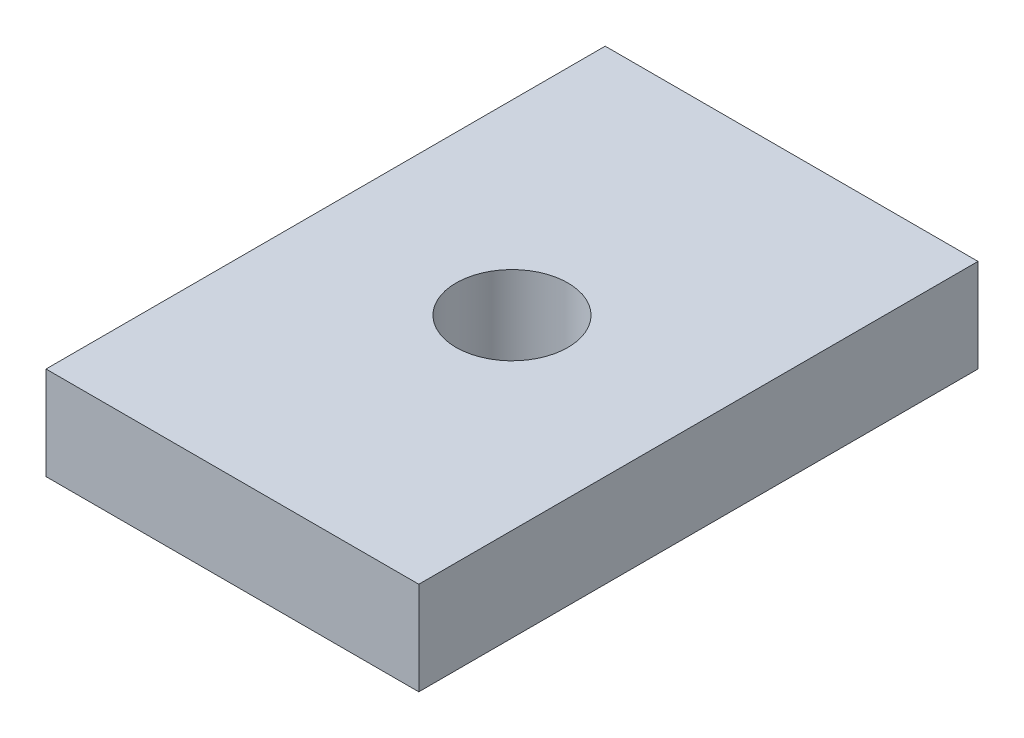
ISO-10303-21;
HEADER;
FILE_DESCRIPTION(('STEP AP214'),'2;1');
FILE_NAME('part.step','',(''),(''),'','','');
FILE_SCHEMA(('AUTOMOTIVE_DESIGN { 1 0 10303 214 1 1 1 1 }'));
ENDSEC;
DATA;
#1=APPLICATION_CONTEXT('core data for automotive mechanical design processes');
#2=APPLICATION_PROTOCOL_DEFINITION('international standard','automotive_design',2000,#1);
#3=PRODUCT_CONTEXT('',#1,'mechanical');
#4=PRODUCT('Part','Part','',(#3));
#5=PRODUCT_RELATED_PRODUCT_CATEGORY('part','',(#4));
#6=PRODUCT_DEFINITION_FORMATION('','',#4);
#7=PRODUCT_DEFINITION_CONTEXT('part definition',#1,'design');
#8=PRODUCT_DEFINITION('design','',#6,#7);
#9=PRODUCT_DEFINITION_SHAPE('','',#8);
#10=(LENGTH_UNIT() NAMED_UNIT(*) SI_UNIT(.MILLI.,.METRE.));
#11=(NAMED_UNIT(*) PLANE_ANGLE_UNIT() SI_UNIT($,.RADIAN.));
#12=(NAMED_UNIT(*) SI_UNIT($,.STERADIAN.) SOLID_ANGLE_UNIT());
#13=UNCERTAINTY_MEASURE_WITH_UNIT(LENGTH_MEASURE(1.E-05),#10,'distance_accuracy_value','');
#14=(GEOMETRIC_REPRESENTATION_CONTEXT(3) GLOBAL_UNCERTAINTY_ASSIGNED_CONTEXT((#13)) GLOBAL_UNIT_ASSIGNED_CONTEXT((#10,
#11,#12)) REPRESENTATION_CONTEXT('',''));
#15=CARTESIAN_POINT('',(0.,0.,0.));
#16=DIRECTION('',(0.,0.,1.));
#17=DIRECTION('',(1.,0.,0.));
#18=AXIS2_PLACEMENT_3D('',#15,#16,#17);
#19=CARTESIAN_POINT('',(0.,5.,0.));
#20=DIRECTION('',(0.,-1.,0.));
#21=DIRECTION('',(0.,0.,-1.));
#22=AXIS2_PLACEMENT_3D('',#19,#20,#21);
#23=PLANE('',#22);
#24=DIRECTION('',(0.,0.,-1.));
#25=VECTOR('',#24,1.);
#26=CARTESIAN_POINT('',(10.,5.,15.));
#27=LINE('',#26,#25);
#28=CARTESIAN_POINT('',(10.,5.,15.));
#29=VERTEX_POINT('',#28);
#30=CARTESIAN_POINT('',(10.,5.,-15.));
#31=VERTEX_POINT('',#30);
#32=EDGE_CURVE('E92',#29,#31,#27,.T.);
#33=ORIENTED_EDGE('',*,*,#32,.T.);
#34=DIRECTION('',(-1.,0.,0.));
#35=VECTOR('',#34,1.);
#36=CARTESIAN_POINT('',(-10.,5.,-15.));
#37=LINE('',#36,#35);
#38=CARTESIAN_POINT('',(-10.,5.,-15.));
#39=VERTEX_POINT('',#38);
#40=EDGE_CURVE('E87',#31,#39,#37,.T.);
#41=ORIENTED_EDGE('',*,*,#40,.T.);
#42=DIRECTION('',(0.,0.,1.));
#43=VECTOR('',#42,1.);
#44=CARTESIAN_POINT('',(-10.,5.,15.));
#45=LINE('',#44,#43);
#46=CARTESIAN_POINT('',(-10.,5.,15.));
#47=VERTEX_POINT('',#46);
#48=EDGE_CURVE('E90',#39,#47,#45,.T.);
#49=ORIENTED_EDGE('',*,*,#48,.T.);
#50=DIRECTION('',(1.,0.,0.));
#51=VECTOR('',#50,1.);
#52=CARTESIAN_POINT('',(-10.,5.,15.));
#53=LINE('',#52,#51);
#54=EDGE_CURVE('E57',#47,#29,#53,.T.);
#55=ORIENTED_EDGE('',*,*,#54,.T.);
#56=EDGE_LOOP('',(#33,#41,#49,#55));
#57=FACE_BOUND('',#56,.T.);
#58=CARTESIAN_POINT('',(0.,5.,0.));
#59=DIRECTION('',(0.,1.,0.));
#60=DIRECTION('',(0.,0.,1.));
#61=AXIS2_PLACEMENT_3D('',#58,#59,#60);
#62=CIRCLE('',#61,3.);
#63=CARTESIAN_POINT('',(0.,5.,3.00000000000001));
#64=VERTEX_POINT('',#63);
#65=EDGE_CURVE('E112',#64,#64,#62,.T.);
#66=ORIENTED_EDGE('',*,*,#65,.F.);
#67=EDGE_LOOP('',(#66));
#68=FACE_BOUND('',#67,.T.);
#69=ADVANCED_FACE('F39',(#57,#68),#23,.F.);
#70=CARTESIAN_POINT('',(0.,0.,0.));
#71=DIRECTION('',(0.,-1.,0.));
#72=DIRECTION('',(0.,0.,-1.));
#73=AXIS2_PLACEMENT_3D('',#70,#71,#72);
#74=PLANE('',#73);
#75=DIRECTION('',(0.,0.,-1.));
#76=VECTOR('',#75,1.);
#77=CARTESIAN_POINT('',(10.,0.,15.));
#78=LINE('',#77,#76);
#79=CARTESIAN_POINT('',(10.,0.,15.));
#80=VERTEX_POINT('',#79);
#81=CARTESIAN_POINT('',(10.,0.,-15.));
#82=VERTEX_POINT('',#81);
#83=EDGE_CURVE('E108',#80,#82,#78,.T.);
#84=ORIENTED_EDGE('',*,*,#83,.F.);
#85=DIRECTION('',(1.,0.,0.));
#86=VECTOR('',#85,1.);
#87=CARTESIAN_POINT('',(-10.,0.,15.));
#88=LINE('',#87,#86);
#89=CARTESIAN_POINT('',(-10.,0.,15.));
#90=VERTEX_POINT('',#89);
#91=EDGE_CURVE('E80',#90,#80,#88,.T.);
#92=ORIENTED_EDGE('',*,*,#91,.F.);
#93=DIRECTION('',(0.,0.,1.));
#94=VECTOR('',#93,1.);
#95=CARTESIAN_POINT('',(-10.,0.,15.));
#96=LINE('',#95,#94);
#97=CARTESIAN_POINT('',(-10.,0.,-15.));
#98=VERTEX_POINT('',#97);
#99=EDGE_CURVE('E74',#98,#90,#96,.T.);
#100=ORIENTED_EDGE('',*,*,#99,.F.);
#101=DIRECTION('',(-1.,0.,0.));
#102=VECTOR('',#101,1.);
#103=CARTESIAN_POINT('',(-10.,0.,-15.));
#104=LINE('',#103,#102);
#105=EDGE_CURVE('E97',#82,#98,#104,.T.);
#106=ORIENTED_EDGE('',*,*,#105,.F.);
#107=EDGE_LOOP('',(#84,#92,#100,#106));
#108=FACE_BOUND('',#107,.T.);
#109=CARTESIAN_POINT('',(0.,0.,0.));
#110=DIRECTION('',(0.,1.,0.));
#111=DIRECTION('',(0.,0.,1.));
#112=AXIS2_PLACEMENT_3D('',#109,#110,#111);
#113=CIRCLE('',#112,3.);
#114=CARTESIAN_POINT('',(0.,0.,3.00000000000001));
#115=VERTEX_POINT('',#114);
#116=EDGE_CURVE('E130',#115,#115,#113,.T.);
#117=ORIENTED_EDGE('',*,*,#116,.T.);
#118=EDGE_LOOP('',(#117));
#119=FACE_BOUND('',#118,.T.);
#120=ADVANCED_FACE('F125',(#108,#119),#74,.T.);
#121=CARTESIAN_POINT('',(10.,5.,15.));
#122=DIRECTION('',(-1.,0.,0.));
#123=DIRECTION('',(0.,0.,1.));
#124=AXIS2_PLACEMENT_3D('',#121,#122,#123);
#125=PLANE('',#124);
#126=ORIENTED_EDGE('',*,*,#83,.T.);
#127=DIRECTION('',(0.,-1.,0.));
#128=VECTOR('',#127,1.);
#129=CARTESIAN_POINT('',(10.,5.,-15.));
#130=LINE('',#129,#128);
#131=EDGE_CURVE('E11',#31,#82,#130,.T.);
#132=ORIENTED_EDGE('',*,*,#131,.F.);
#133=ORIENTED_EDGE('',*,*,#32,.F.);
#134=DIRECTION('',(0.,-1.,0.));
#135=VECTOR('',#134,1.);
#136=CARTESIAN_POINT('',(10.,5.,15.));
#137=LINE('',#136,#135);
#138=EDGE_CURVE('E104',#29,#80,#137,.T.);
#139=ORIENTED_EDGE('',*,*,#138,.T.);
#140=EDGE_LOOP('',(#126,#132,#133,#139));
#141=FACE_BOUND('',#140,.T.);
#142=ADVANCED_FACE('F41',(#141),#125,.F.);
#143=CARTESIAN_POINT('',(-10.,5.,-15.));
#144=DIRECTION('',(0.,0.,1.));
#145=DIRECTION('',(1.,0.,0.));
#146=AXIS2_PLACEMENT_3D('',#143,#144,#145);
#147=PLANE('',#146);
#148=ORIENTED_EDGE('',*,*,#105,.T.);
#149=DIRECTION('',(0.,-1.,0.));
#150=VECTOR('',#149,1.);
#151=CARTESIAN_POINT('',(-10.,5.,-15.));
#152=LINE('',#151,#150);
#153=EDGE_CURVE('E49',#39,#98,#152,.T.);
#154=ORIENTED_EDGE('',*,*,#153,.F.);
#155=ORIENTED_EDGE('',*,*,#40,.F.);
#156=ORIENTED_EDGE('',*,*,#131,.T.);
#157=EDGE_LOOP('',(#148,#154,#155,#156));
#158=FACE_BOUND('',#157,.T.);
#159=ADVANCED_FACE('F96',(#158),#147,.F.);
#160=CARTESIAN_POINT('',(-10.,5.,15.));
#161=DIRECTION('',(1.,0.,0.));
#162=DIRECTION('',(0.,0.,-1.));
#163=AXIS2_PLACEMENT_3D('',#160,#161,#162);
#164=PLANE('',#163);
#165=ORIENTED_EDGE('',*,*,#99,.T.);
#166=DIRECTION('',(0.,-1.,0.));
#167=VECTOR('',#166,1.);
#168=CARTESIAN_POINT('',(-10.,5.,15.));
#169=LINE('',#168,#167);
#170=EDGE_CURVE('E99',#47,#90,#169,.T.);
#171=ORIENTED_EDGE('',*,*,#170,.F.);
#172=ORIENTED_EDGE('',*,*,#48,.F.);
#173=ORIENTED_EDGE('',*,*,#153,.T.);
#174=EDGE_LOOP('',(#165,#171,#172,#173));
#175=FACE_BOUND('',#174,.T.);
#176=ADVANCED_FACE('F100',(#175),#164,.F.);
#177=CARTESIAN_POINT('',(-10.,5.,15.));
#178=DIRECTION('',(0.,0.,-1.));
#179=DIRECTION('',(-1.,0.,0.));
#180=AXIS2_PLACEMENT_3D('',#177,#178,#179);
#181=PLANE('',#180);
#182=ORIENTED_EDGE('',*,*,#91,.T.);
#183=ORIENTED_EDGE('',*,*,#138,.F.);
#184=ORIENTED_EDGE('',*,*,#54,.F.);
#185=ORIENTED_EDGE('',*,*,#170,.T.);
#186=EDGE_LOOP('',(#182,#183,#184,#185));
#187=FACE_BOUND('',#186,.T.);
#188=ADVANCED_FACE('F122',(#187),#181,.F.);
#189=CARTESIAN_POINT('',(0.,5.,0.));
#190=DIRECTION('',(0.,-1.,0.));
#191=DIRECTION('',(0.,0.,-1.));
#192=AXIS2_PLACEMENT_3D('',#189,#190,#191);
#193=CYLINDRICAL_SURFACE('',#192,3.);
#194=ORIENTED_EDGE('',*,*,#65,.T.);
#195=EDGE_LOOP('',(#194));
#196=FACE_BOUND('',#195,.T.);
#197=ORIENTED_EDGE('',*,*,#116,.F.);
#198=EDGE_LOOP('',(#197));
#199=FACE_BOUND('',#198,.T.);
#200=ADVANCED_FACE('F138',(#196,#199),#193,.F.);
#201=CLOSED_SHELL('',(#69,#120,#142,#159,#176,#188,#200));
#202=MANIFOLD_SOLID_BREP('B2',#201);
#203=ADVANCED_BREP_SHAPE_REPRESENTATION('',(#18,#202),#14);
#204=SHAPE_DEFINITION_REPRESENTATION(#9,#203);
ENDSEC;
END-ISO-10303-21;
